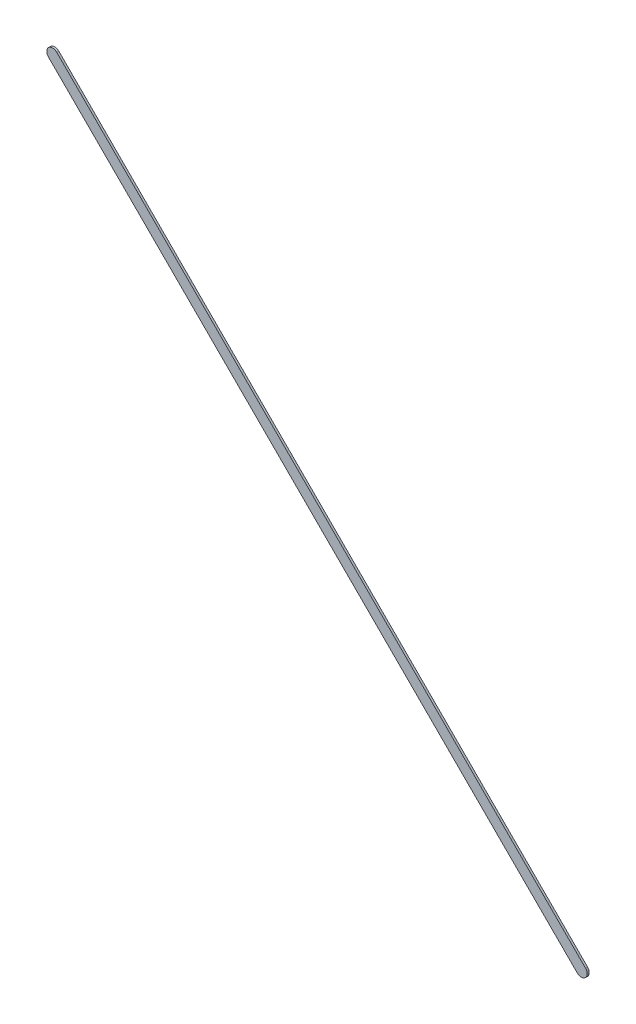
ISO-10303-21;
HEADER;
FILE_DESCRIPTION(('STEP AP214'),'2;1');
FILE_NAME('part.step','',(''),(''),'','','');
FILE_SCHEMA(('AUTOMOTIVE_DESIGN { 1 0 10303 214 1 1 1 1 }'));
ENDSEC;
DATA;
#1=APPLICATION_CONTEXT('core data for automotive mechanical design processes');
#2=APPLICATION_PROTOCOL_DEFINITION('international standard','automotive_design',2000,#1);
#3=PRODUCT_CONTEXT('',#1,'mechanical');
#4=PRODUCT('Part','Part','',(#3));
#5=PRODUCT_RELATED_PRODUCT_CATEGORY('part','',(#4));
#6=PRODUCT_DEFINITION_FORMATION('','',#4);
#7=PRODUCT_DEFINITION_CONTEXT('part definition',#1,'design');
#8=PRODUCT_DEFINITION('design','',#6,#7);
#9=PRODUCT_DEFINITION_SHAPE('','',#8);
#10=(LENGTH_UNIT() NAMED_UNIT(*) SI_UNIT(.MILLI.,.METRE.));
#11=(NAMED_UNIT(*) PLANE_ANGLE_UNIT() SI_UNIT($,.RADIAN.));
#12=(NAMED_UNIT(*) SI_UNIT($,.STERADIAN.) SOLID_ANGLE_UNIT());
#13=UNCERTAINTY_MEASURE_WITH_UNIT(LENGTH_MEASURE(1.E-05),#10,'distance_accuracy_value','');
#14=(GEOMETRIC_REPRESENTATION_CONTEXT(3) GLOBAL_UNCERTAINTY_ASSIGNED_CONTEXT((#13)) GLOBAL_UNIT_ASSIGNED_CONTEXT((#10,
#11,#12)) REPRESENTATION_CONTEXT('',''));
#15=CARTESIAN_POINT('',(0.,0.,0.));
#16=DIRECTION('',(0.,0.,1.));
#17=DIRECTION('',(1.,0.,0.));
#18=AXIS2_PLACEMENT_3D('',#15,#16,#17);
#19=CARTESIAN_POINT('',(114.90271,-134.060789,1.635));
#20=DIRECTION('',(0.,0.,1.));
#21=DIRECTION('',(1.,0.,0.));
#22=AXIS2_PLACEMENT_3D('',#19,#20,#21);
#23=PLANE('',#22);
#24=DIRECTION('',(-0.707106781186548,0.707106781186548,0.));
#25=VECTOR('',#24,1.);
#26=CARTESIAN_POINT('',(114.90271,-134.060789,1.635));
#27=LINE('',#26,#25);
#28=CARTESIAN_POINT('',(114.90271,-134.060789,1.635));
#29=VERTEX_POINT('',#28);
#30=CARTESIAN_POINT('',(105.87121,-125.029289,1.635));
#31=VERTEX_POINT('',#30);
#32=EDGE_CURVE('E81',#29,#31,#27,.T.);
#33=ORIENTED_EDGE('',*,*,#32,.T.);
#34=CARTESIAN_POINT('',(105.8004995,-125.0999995,1.635));
#35=DIRECTION('',(0.,0.,1.));
#36=DIRECTION('',(0.707106781187048,0.707106781186048,0.));
#37=AXIS2_PLACEMENT_3D('',#34,#35,#36);
#38=CIRCLE('',#37,0.09999974810218);
#39=CARTESIAN_POINT('',(105.729789,-125.17071,1.635));
#40=VERTEX_POINT('',#39);
#41=EDGE_CURVE('E105',#31,#40,#38,.T.);
#42=ORIENTED_EDGE('',*,*,#41,.T.);
#43=DIRECTION('',(0.707106781186548,-0.707106781186548,0.));
#44=VECTOR('',#43,1.);
#45=CARTESIAN_POINT('',(105.729789,-125.17071,1.635));
#46=LINE('',#45,#44);
#47=CARTESIAN_POINT('',(114.761289,-134.20221,1.635));
#48=VERTEX_POINT('',#47);
#49=EDGE_CURVE('E74',#40,#48,#46,.T.);
#50=ORIENTED_EDGE('',*,*,#49,.T.);
#51=CARTESIAN_POINT('',(114.8319995,-134.1314995,1.635));
#52=DIRECTION('',(0.,0.,1.));
#53=DIRECTION('',(-0.707106781186548,-0.707106781186548,0.));
#54=AXIS2_PLACEMENT_3D('',#51,#52,#53);
#55=CIRCLE('',#54,0.09999974810218);
#56=EDGE_CURVE('E11',#48,#29,#55,.T.);
#57=ORIENTED_EDGE('',*,*,#56,.T.);
#58=EDGE_LOOP('',(#33,#42,#50,#57));
#59=FACE_BOUND('',#58,.T.);
#60=ADVANCED_FACE('F17',(#59),#23,.T.);
#61=CARTESIAN_POINT('',(114.90271,-134.060789,1.6));
#62=DIRECTION('',(0.,0.,1.));
#63=DIRECTION('',(1.,0.,0.));
#64=AXIS2_PLACEMENT_3D('',#61,#62,#63);
#65=PLANE('',#64);
#66=CARTESIAN_POINT('',(114.8319995,-134.1314995,1.6));
#67=DIRECTION('',(0.,0.,1.));
#68=DIRECTION('',(-0.707106781186548,-0.707106781186548,0.));
#69=AXIS2_PLACEMENT_3D('',#66,#67,#68);
#70=CIRCLE('',#69,0.09999974810218);
#71=CARTESIAN_POINT('',(114.761289,-134.20221,1.6));
#72=VERTEX_POINT('',#71);
#73=CARTESIAN_POINT('',(114.90271,-134.060789,1.6));
#74=VERTEX_POINT('',#73);
#75=EDGE_CURVE('E25',#72,#74,#70,.T.);
#76=ORIENTED_EDGE('',*,*,#75,.F.);
#77=DIRECTION('',(0.707106781186548,-0.707106781186548,0.));
#78=VECTOR('',#77,1.);
#79=CARTESIAN_POINT('',(105.729789,-125.17071,1.6));
#80=LINE('',#79,#78);
#81=CARTESIAN_POINT('',(105.729789,-125.17071,1.6));
#82=VERTEX_POINT('',#81);
#83=EDGE_CURVE('E99',#82,#72,#80,.T.);
#84=ORIENTED_EDGE('',*,*,#83,.F.);
#85=CARTESIAN_POINT('',(105.8004995,-125.0999995,1.6));
#86=DIRECTION('',(0.,0.,1.));
#87=DIRECTION('',(0.707106781187048,0.707106781186048,0.));
#88=AXIS2_PLACEMENT_3D('',#85,#86,#87);
#89=CIRCLE('',#88,0.09999974810218);
#90=CARTESIAN_POINT('',(105.87121,-125.029289,1.6));
#91=VERTEX_POINT('',#90);
#92=EDGE_CURVE('E83',#91,#82,#89,.T.);
#93=ORIENTED_EDGE('',*,*,#92,.F.);
#94=DIRECTION('',(-0.707106781186548,0.707106781186548,0.));
#95=VECTOR('',#94,1.);
#96=CARTESIAN_POINT('',(114.90271,-134.060789,1.6));
#97=LINE('',#96,#95);
#98=EDGE_CURVE('E79',#74,#91,#97,.T.);
#99=ORIENTED_EDGE('',*,*,#98,.F.);
#100=EDGE_LOOP('',(#76,#84,#93,#99));
#101=FACE_BOUND('',#100,.T.);
#102=ADVANCED_FACE('F85',(#101),#65,.F.);
#103=CARTESIAN_POINT('',(114.8319995,-134.1314995,1.6));
#104=DIRECTION('',(0.,0.,-1.));
#105=DIRECTION('',(-0.707106781186548,-0.707106781186548,0.));
#106=AXIS2_PLACEMENT_3D('',#103,#104,#105);
#107=CYLINDRICAL_SURFACE('',#106,0.09999974810218);
#108=ORIENTED_EDGE('',*,*,#75,.T.);
#109=DIRECTION('',(0.,0.,1.));
#110=VECTOR('',#109,1.);
#111=CARTESIAN_POINT('',(114.90271,-134.060789,1.6));
#112=LINE('',#111,#110);
#113=EDGE_CURVE('E68',#74,#29,#112,.T.);
#114=ORIENTED_EDGE('',*,*,#113,.T.);
#115=ORIENTED_EDGE('',*,*,#56,.F.);
#116=DIRECTION('',(0.,0.,1.));
#117=VECTOR('',#116,1.);
#118=CARTESIAN_POINT('',(114.761289,-134.20221,1.6));
#119=LINE('',#118,#117);
#120=EDGE_CURVE('E71',#72,#48,#119,.T.);
#121=ORIENTED_EDGE('',*,*,#120,.F.);
#122=EDGE_LOOP('',(#108,#114,#115,#121));
#123=FACE_BOUND('',#122,.T.);
#124=ADVANCED_FACE('F67',(#123),#107,.T.);
#125=CARTESIAN_POINT('',(105.729789,-125.17071,1.6));
#126=DIRECTION('',(0.707106781186548,0.707106781186548,0.));
#127=DIRECTION('',(0.,0.,-1.));
#128=AXIS2_PLACEMENT_3D('',#125,#126,#127);
#129=PLANE('',#128);
#130=ORIENTED_EDGE('',*,*,#83,.T.);
#131=ORIENTED_EDGE('',*,*,#120,.T.);
#132=ORIENTED_EDGE('',*,*,#49,.F.);
#133=DIRECTION('',(0.,0.,1.));
#134=VECTOR('',#133,1.);
#135=CARTESIAN_POINT('',(105.729789,-125.17071,1.6));
#136=LINE('',#135,#134);
#137=EDGE_CURVE('E102',#82,#40,#136,.T.);
#138=ORIENTED_EDGE('',*,*,#137,.F.);
#139=EDGE_LOOP('',(#130,#131,#132,#138));
#140=FACE_BOUND('',#139,.T.);
#141=ADVANCED_FACE('F120',(#140),#129,.F.);
#142=CARTESIAN_POINT('',(105.8004995,-125.0999995,1.6));
#143=DIRECTION('',(0.,0.,-1.));
#144=DIRECTION('',(0.707106781187048,0.707106781186048,0.));
#145=AXIS2_PLACEMENT_3D('',#142,#143,#144);
#146=CYLINDRICAL_SURFACE('',#145,0.09999974810218);
#147=ORIENTED_EDGE('',*,*,#92,.T.);
#148=ORIENTED_EDGE('',*,*,#137,.T.);
#149=ORIENTED_EDGE('',*,*,#41,.F.);
#150=DIRECTION('',(0.,0.,1.));
#151=VECTOR('',#150,1.);
#152=CARTESIAN_POINT('',(105.87121,-125.029289,1.6));
#153=LINE('',#152,#151);
#154=EDGE_CURVE('E89',#91,#31,#153,.T.);
#155=ORIENTED_EDGE('',*,*,#154,.F.);
#156=EDGE_LOOP('',(#147,#148,#149,#155));
#157=FACE_BOUND('',#156,.T.);
#158=ADVANCED_FACE('F122',(#157),#146,.T.);
#159=CARTESIAN_POINT('',(114.90271,-134.060789,1.6));
#160=DIRECTION('',(-0.707106781186548,-0.707106781186548,0.));
#161=DIRECTION('',(-0.707106781186548,0.707106781186548,0.));
#162=AXIS2_PLACEMENT_3D('',#159,#160,#161);
#163=PLANE('',#162);
#164=ORIENTED_EDGE('',*,*,#98,.T.);
#165=ORIENTED_EDGE('',*,*,#154,.T.);
#166=ORIENTED_EDGE('',*,*,#32,.F.);
#167=ORIENTED_EDGE('',*,*,#113,.F.);
#168=EDGE_LOOP('',(#164,#165,#166,#167));
#169=FACE_BOUND('',#168,.T.);
#170=ADVANCED_FACE('F77',(#169),#163,.F.);
#171=CLOSED_SHELL('',(#60,#102,#124,#141,#158,#170));
#172=MANIFOLD_SOLID_BREP('B1',#171);
#173=ADVANCED_BREP_SHAPE_REPRESENTATION('',(#18,#172),#14);
#174=SHAPE_DEFINITION_REPRESENTATION(#9,#173);
ENDSEC;
END-ISO-10303-21;
